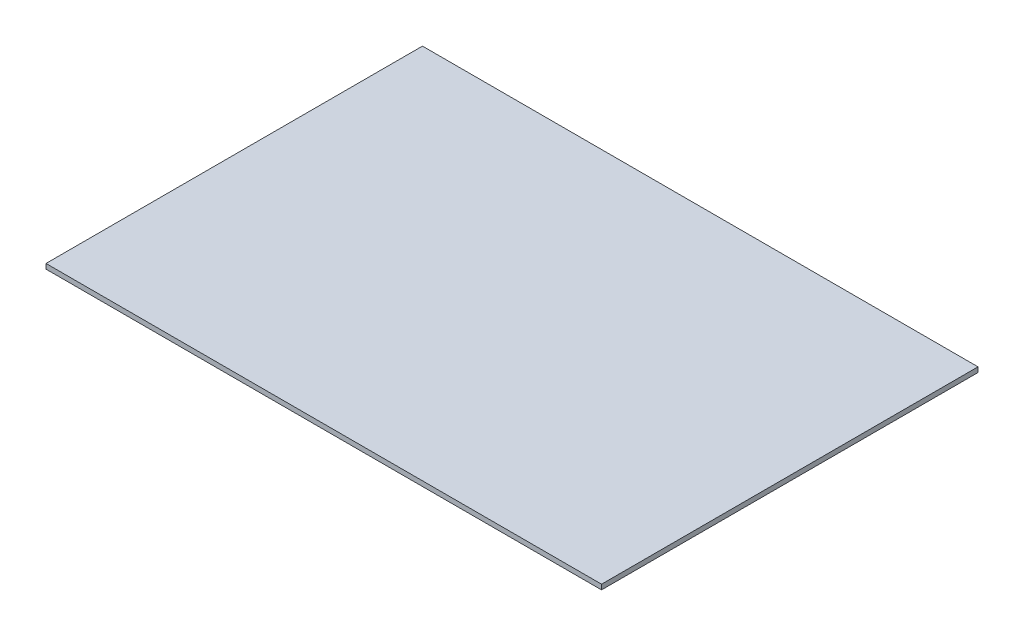
ISO-10303-21;
HEADER;
FILE_DESCRIPTION(('STEP AP214'),'2;1');
FILE_NAME('part.step','',(''),(''),'','','');
FILE_SCHEMA(('AUTOMOTIVE_DESIGN { 1 0 10303 214 1 1 1 1 }'));
ENDSEC;
DATA;
#1=APPLICATION_CONTEXT('core data for automotive mechanical design processes');
#2=APPLICATION_PROTOCOL_DEFINITION('international standard','automotive_design',2000,#1);
#3=PRODUCT_CONTEXT('',#1,'mechanical');
#4=PRODUCT('Part','Part','',(#3));
#5=PRODUCT_RELATED_PRODUCT_CATEGORY('part','',(#4));
#6=PRODUCT_DEFINITION_FORMATION('','',#4);
#7=PRODUCT_DEFINITION_CONTEXT('part definition',#1,'design');
#8=PRODUCT_DEFINITION('design','',#6,#7);
#9=PRODUCT_DEFINITION_SHAPE('','',#8);
#10=(LENGTH_UNIT() NAMED_UNIT(*) SI_UNIT(.MILLI.,.METRE.));
#11=(NAMED_UNIT(*) PLANE_ANGLE_UNIT() SI_UNIT($,.RADIAN.));
#12=(NAMED_UNIT(*) SI_UNIT($,.STERADIAN.) SOLID_ANGLE_UNIT());
#13=UNCERTAINTY_MEASURE_WITH_UNIT(LENGTH_MEASURE(1.E-05),#10,'distance_accuracy_value','');
#14=(GEOMETRIC_REPRESENTATION_CONTEXT(3) GLOBAL_UNCERTAINTY_ASSIGNED_CONTEXT((#13)) GLOBAL_UNIT_ASSIGNED_CONTEXT((#10,
#11,#12)) REPRESENTATION_CONTEXT('',''));
#15=CARTESIAN_POINT('',(0.,0.,0.));
#16=DIRECTION('',(0.,0.,1.));
#17=DIRECTION('',(1.,0.,0.));
#18=AXIS2_PLACEMENT_3D('',#15,#16,#17);
#19=CARTESIAN_POINT('',(0.,3.,0.));
#20=DIRECTION('',(1.,0.,0.));
#21=DIRECTION('',(0.,0.,-1.));
#22=AXIS2_PLACEMENT_3D('',#19,#20,#21);
#23=PLANE('',#22);
#24=DIRECTION('',(0.,0.,1.));
#25=VECTOR('',#24,1.);
#26=CARTESIAN_POINT('',(0.,0.,0.));
#27=LINE('',#26,#25);
#28=CARTESIAN_POINT('',(0.,0.,-227.69));
#29=VERTEX_POINT('',#28);
#30=CARTESIAN_POINT('',(0.,0.,0.));
#31=VERTEX_POINT('',#30);
#32=EDGE_CURVE('E100',#29,#31,#27,.T.);
#33=ORIENTED_EDGE('',*,*,#32,.T.);
#34=DIRECTION('',(0.,-1.,0.));
#35=VECTOR('',#34,1.);
#36=CARTESIAN_POINT('',(0.,3.,0.));
#37=LINE('',#36,#35);
#38=CARTESIAN_POINT('',(0.,3.,0.));
#39=VERTEX_POINT('',#38);
#40=EDGE_CURVE('E11',#39,#31,#37,.T.);
#41=ORIENTED_EDGE('',*,*,#40,.F.);
#42=DIRECTION('',(0.,0.,1.));
#43=VECTOR('',#42,1.);
#44=CARTESIAN_POINT('',(0.,3.,0.));
#45=LINE('',#44,#43);
#46=CARTESIAN_POINT('',(0.,3.,-227.69));
#47=VERTEX_POINT('',#46);
#48=EDGE_CURVE('E88',#47,#39,#45,.T.);
#49=ORIENTED_EDGE('',*,*,#48,.F.);
#50=DIRECTION('',(0.,-1.,0.));
#51=VECTOR('',#50,1.);
#52=CARTESIAN_POINT('',(0.,3.,-227.69));
#53=LINE('',#52,#51);
#54=EDGE_CURVE('E96',#47,#29,#53,.T.);
#55=ORIENTED_EDGE('',*,*,#54,.T.);
#56=EDGE_LOOP('',(#33,#41,#49,#55));
#57=FACE_BOUND('',#56,.T.);
#58=ADVANCED_FACE('F37',(#57),#23,.F.);
#59=CARTESIAN_POINT('',(0.,3.,0.));
#60=DIRECTION('',(0.,0.,-1.));
#61=DIRECTION('',(-1.,0.,0.));
#62=AXIS2_PLACEMENT_3D('',#59,#60,#61);
#63=PLANE('',#62);
#64=DIRECTION('',(1.,0.,0.));
#65=VECTOR('',#64,1.);
#66=CARTESIAN_POINT('',(0.,0.,0.));
#67=LINE('',#66,#65);
#68=CARTESIAN_POINT('',(336.,0.,0.));
#69=VERTEX_POINT('',#68);
#70=EDGE_CURVE('E92',#31,#69,#67,.T.);
#71=ORIENTED_EDGE('',*,*,#70,.T.);
#72=DIRECTION('',(0.,-1.,0.));
#73=VECTOR('',#72,1.);
#74=CARTESIAN_POINT('',(336.,3.,0.));
#75=LINE('',#74,#73);
#76=CARTESIAN_POINT('',(336.,3.,0.));
#77=VERTEX_POINT('',#76);
#78=EDGE_CURVE('E45',#77,#69,#75,.T.);
#79=ORIENTED_EDGE('',*,*,#78,.F.);
#80=DIRECTION('',(1.,0.,0.));
#81=VECTOR('',#80,1.);
#82=CARTESIAN_POINT('',(0.,3.,0.));
#83=LINE('',#82,#81);
#84=EDGE_CURVE('E83',#39,#77,#83,.T.);
#85=ORIENTED_EDGE('',*,*,#84,.F.);
#86=ORIENTED_EDGE('',*,*,#40,.T.);
#87=EDGE_LOOP('',(#71,#79,#85,#86));
#88=FACE_BOUND('',#87,.T.);
#89=ADVANCED_FACE('F91',(#88),#63,.F.);
#90=CARTESIAN_POINT('',(336.,3.,0.));
#91=DIRECTION('',(-1.,0.,0.));
#92=DIRECTION('',(0.,0.,1.));
#93=AXIS2_PLACEMENT_3D('',#90,#91,#92);
#94=PLANE('',#93);
#95=DIRECTION('',(0.,0.,-1.));
#96=VECTOR('',#95,1.);
#97=CARTESIAN_POINT('',(336.,0.,0.));
#98=LINE('',#97,#96);
#99=CARTESIAN_POINT('',(336.,0.,-227.69));
#100=VERTEX_POINT('',#99);
#101=EDGE_CURVE('E70',#69,#100,#98,.T.);
#102=ORIENTED_EDGE('',*,*,#101,.T.);
#103=DIRECTION('',(0.,-1.,0.));
#104=VECTOR('',#103,1.);
#105=CARTESIAN_POINT('',(336.,3.,-227.69));
#106=LINE('',#105,#104);
#107=CARTESIAN_POINT('',(336.,3.,-227.69));
#108=VERTEX_POINT('',#107);
#109=EDGE_CURVE('E93',#108,#100,#106,.T.);
#110=ORIENTED_EDGE('',*,*,#109,.F.);
#111=DIRECTION('',(0.,0.,-1.));
#112=VECTOR('',#111,1.);
#113=CARTESIAN_POINT('',(336.,3.,0.));
#114=LINE('',#113,#112);
#115=EDGE_CURVE('E86',#77,#108,#114,.T.);
#116=ORIENTED_EDGE('',*,*,#115,.F.);
#117=ORIENTED_EDGE('',*,*,#78,.T.);
#118=EDGE_LOOP('',(#102,#110,#116,#117));
#119=FACE_BOUND('',#118,.T.);
#120=ADVANCED_FACE('F94',(#119),#94,.F.);
#121=CARTESIAN_POINT('',(0.,3.,-227.69));
#122=DIRECTION('',(0.,0.,1.));
#123=DIRECTION('',(1.,0.,0.));
#124=AXIS2_PLACEMENT_3D('',#121,#122,#123);
#125=PLANE('',#124);
#126=DIRECTION('',(-1.,0.,0.));
#127=VECTOR('',#126,1.);
#128=CARTESIAN_POINT('',(0.,0.,-227.69));
#129=LINE('',#128,#127);
#130=EDGE_CURVE('E76',#100,#29,#129,.T.);
#131=ORIENTED_EDGE('',*,*,#130,.T.);
#132=ORIENTED_EDGE('',*,*,#54,.F.);
#133=DIRECTION('',(-1.,0.,0.));
#134=VECTOR('',#133,1.);
#135=CARTESIAN_POINT('',(0.,3.,-227.69));
#136=LINE('',#135,#134);
#137=EDGE_CURVE('E53',#108,#47,#136,.T.);
#138=ORIENTED_EDGE('',*,*,#137,.F.);
#139=ORIENTED_EDGE('',*,*,#109,.T.);
#140=EDGE_LOOP('',(#131,#132,#138,#139));
#141=FACE_BOUND('',#140,.T.);
#142=ADVANCED_FACE('F107',(#141),#125,.F.);
#143=CARTESIAN_POINT('',(0.,3.,0.));
#144=DIRECTION('',(0.,-1.,0.));
#145=DIRECTION('',(0.,0.,-1.));
#146=AXIS2_PLACEMENT_3D('',#143,#144,#145);
#147=PLANE('',#146);
#148=ORIENTED_EDGE('',*,*,#48,.T.);
#149=ORIENTED_EDGE('',*,*,#84,.T.);
#150=ORIENTED_EDGE('',*,*,#115,.T.);
#151=ORIENTED_EDGE('',*,*,#137,.T.);
#152=EDGE_LOOP('',(#148,#149,#150,#151));
#153=FACE_BOUND('',#152,.T.);
#154=ADVANCED_FACE('F84',(#153),#147,.F.);
#155=CARTESIAN_POINT('',(0.,0.,0.));
#156=DIRECTION('',(0.,-1.,0.));
#157=DIRECTION('',(0.,0.,-1.));
#158=AXIS2_PLACEMENT_3D('',#155,#156,#157);
#159=PLANE('',#158);
#160=ORIENTED_EDGE('',*,*,#32,.F.);
#161=ORIENTED_EDGE('',*,*,#130,.F.);
#162=ORIENTED_EDGE('',*,*,#101,.F.);
#163=ORIENTED_EDGE('',*,*,#70,.F.);
#164=EDGE_LOOP('',(#160,#161,#162,#163));
#165=FACE_BOUND('',#164,.T.);
#166=ADVANCED_FACE('F110',(#165),#159,.T.);
#167=CLOSED_SHELL('',(#58,#89,#120,#142,#154,#166));
#168=MANIFOLD_SOLID_BREP('B2',#167);
#169=ADVANCED_BREP_SHAPE_REPRESENTATION('',(#18,#168),#14);
#170=SHAPE_DEFINITION_REPRESENTATION(#9,#169);
ENDSEC;
END-ISO-10303-21;
